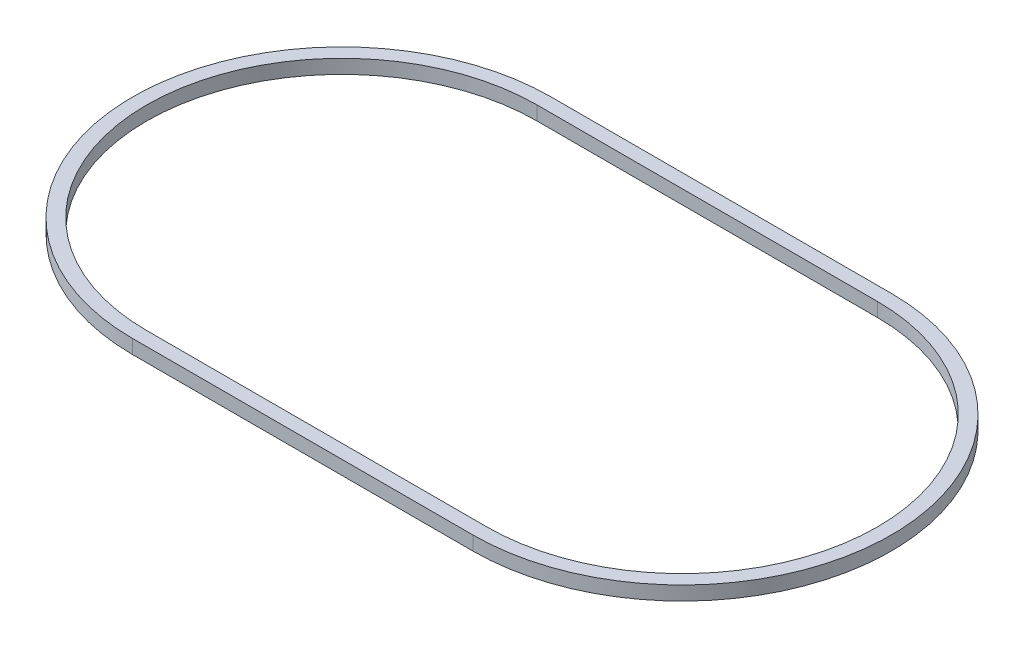
ISO-10303-21;
HEADER;
FILE_DESCRIPTION(('STEP AP214'),'2;1');
FILE_NAME('part.step','',(''),(''),'','','');
FILE_SCHEMA(('AUTOMOTIVE_DESIGN { 1 0 10303 214 1 1 1 1 }'));
ENDSEC;
DATA;
#1=APPLICATION_CONTEXT('core data for automotive mechanical design processes');
#2=APPLICATION_PROTOCOL_DEFINITION('international standard','automotive_design',2000,#1);
#3=PRODUCT_CONTEXT('',#1,'mechanical');
#4=PRODUCT('Part','Part','',(#3));
#5=PRODUCT_RELATED_PRODUCT_CATEGORY('part','',(#4));
#6=PRODUCT_DEFINITION_FORMATION('','',#4);
#7=PRODUCT_DEFINITION_CONTEXT('part definition',#1,'design');
#8=PRODUCT_DEFINITION('design','',#6,#7);
#9=PRODUCT_DEFINITION_SHAPE('','',#8);
#10=(LENGTH_UNIT() NAMED_UNIT(*) SI_UNIT(.MILLI.,.METRE.));
#11=(NAMED_UNIT(*) PLANE_ANGLE_UNIT() SI_UNIT($,.RADIAN.));
#12=(NAMED_UNIT(*) SI_UNIT($,.STERADIAN.) SOLID_ANGLE_UNIT());
#13=UNCERTAINTY_MEASURE_WITH_UNIT(LENGTH_MEASURE(1.E-05),#10,'distance_accuracy_value','');
#14=(GEOMETRIC_REPRESENTATION_CONTEXT(3) GLOBAL_UNCERTAINTY_ASSIGNED_CONTEXT((#13)) GLOBAL_UNIT_ASSIGNED_CONTEXT((#10,
#11,#12)) REPRESENTATION_CONTEXT('',''));
#15=CARTESIAN_POINT('',(0.,0.,0.));
#16=DIRECTION('',(0.,0.,1.));
#17=DIRECTION('',(1.,0.,0.));
#18=AXIS2_PLACEMENT_3D('',#15,#16,#17);
#19=CARTESIAN_POINT('',(0.,2.5,0.));
#20=DIRECTION('',(0.,1.,0.));
#21=DIRECTION('',(0.,0.,1.));
#22=AXIS2_PLACEMENT_3D('',#19,#20,#21);
#23=PLANE('',#22);
#24=CARTESIAN_POINT('',(0.,2.5,0.));
#25=DIRECTION('',(0.,1.,0.));
#26=DIRECTION('',(0.,0.,1.));
#27=AXIS2_PLACEMENT_3D('',#24,#25,#26);
#28=CIRCLE('',#27,37.5);
#29=CARTESIAN_POINT('',(0.,2.5,-37.5));
#30=VERTEX_POINT('',#29);
#31=CARTESIAN_POINT('',(0.,2.5,37.5));
#32=VERTEX_POINT('',#31);
#33=EDGE_CURVE('E133',#30,#32,#28,.T.);
#34=ORIENTED_EDGE('',*,*,#33,.T.);
#35=DIRECTION('',(1.,0.,0.));
#36=VECTOR('',#35,1.);
#37=CARTESIAN_POINT('',(0.,2.5,37.5));
#38=LINE('',#37,#36);
#39=CARTESIAN_POINT('',(61.,2.5,37.5));
#40=VERTEX_POINT('',#39);
#41=EDGE_CURVE('E136',#32,#40,#38,.T.);
#42=ORIENTED_EDGE('',*,*,#41,.T.);
#43=CARTESIAN_POINT('',(61.,2.5,0.));
#44=DIRECTION('',(0.,1.,0.));
#45=DIRECTION('',(0.,0.,1.));
#46=AXIS2_PLACEMENT_3D('',#43,#44,#45);
#47=CIRCLE('',#46,37.5);
#48=CARTESIAN_POINT('',(61.,2.5,-37.5));
#49=VERTEX_POINT('',#48);
#50=EDGE_CURVE('E139',#40,#49,#47,.T.);
#51=ORIENTED_EDGE('',*,*,#50,.T.);
#52=DIRECTION('',(-1.,0.,0.));
#53=VECTOR('',#52,1.);
#54=CARTESIAN_POINT('',(0.,2.5,-37.5));
#55=LINE('',#54,#53);
#56=EDGE_CURVE('E141',#49,#30,#55,.T.);
#57=ORIENTED_EDGE('',*,*,#56,.T.);
#58=EDGE_LOOP('',(#34,#42,#51,#57));
#59=FACE_BOUND('',#58,.T.);
#60=DIRECTION('',(1.,0.,0.));
#61=VECTOR('',#60,1.);
#62=CARTESIAN_POINT('',(0.,2.5,35.));
#63=LINE('',#62,#61);
#64=CARTESIAN_POINT('',(0.,2.5,35.));
#65=VERTEX_POINT('',#64);
#66=CARTESIAN_POINT('',(61.,2.5,35.));
#67=VERTEX_POINT('',#66);
#68=EDGE_CURVE('E105',#65,#67,#63,.T.);
#69=ORIENTED_EDGE('',*,*,#68,.F.);
#70=CARTESIAN_POINT('',(0.,2.5,0.));
#71=DIRECTION('',(0.,1.,0.));
#72=DIRECTION('',(0.,0.,1.));
#73=AXIS2_PLACEMENT_3D('',#70,#71,#72);
#74=CIRCLE('',#73,35.);
#75=CARTESIAN_POINT('',(0.,2.5,-35.));
#76=VERTEX_POINT('',#75);
#77=EDGE_CURVE('E97',#76,#65,#74,.T.);
#78=ORIENTED_EDGE('',*,*,#77,.F.);
#79=DIRECTION('',(-1.,0.,0.));
#80=VECTOR('',#79,1.);
#81=CARTESIAN_POINT('',(0.,2.5,-35.));
#82=LINE('',#81,#80);
#83=CARTESIAN_POINT('',(61.,2.5,-35.));
#84=VERTEX_POINT('',#83);
#85=EDGE_CURVE('E119',#84,#76,#82,.T.);
#86=ORIENTED_EDGE('',*,*,#85,.F.);
#87=CARTESIAN_POINT('',(61.,2.5,0.));
#88=DIRECTION('',(0.,1.,0.));
#89=DIRECTION('',(0.,0.,1.));
#90=AXIS2_PLACEMENT_3D('',#87,#88,#89);
#91=CIRCLE('',#90,35.);
#92=EDGE_CURVE('E117',#67,#84,#91,.T.);
#93=ORIENTED_EDGE('',*,*,#92,.F.);
#94=EDGE_LOOP('',(#69,#78,#86,#93));
#95=FACE_BOUND('',#94,.T.);
#96=ADVANCED_FACE('F32',(#59,#95),#23,.T.);
#97=CARTESIAN_POINT('',(0.,0.,0.));
#98=DIRECTION('',(0.,1.,0.));
#99=DIRECTION('',(0.,0.,1.));
#100=AXIS2_PLACEMENT_3D('',#97,#98,#99);
#101=PLANE('',#100);
#102=CARTESIAN_POINT('',(0.,0.,0.));
#103=DIRECTION('',(0.,1.,0.));
#104=DIRECTION('',(0.,0.,1.));
#105=AXIS2_PLACEMENT_3D('',#102,#103,#104);
#106=CIRCLE('',#105,37.5);
#107=CARTESIAN_POINT('',(0.,0.,-37.5));
#108=VERTEX_POINT('',#107);
#109=CARTESIAN_POINT('',(0.,0.,37.5));
#110=VERTEX_POINT('',#109);
#111=EDGE_CURVE('E113',#108,#110,#106,.T.);
#112=ORIENTED_EDGE('',*,*,#111,.F.);
#113=DIRECTION('',(-1.,0.,0.));
#114=VECTOR('',#113,1.);
#115=CARTESIAN_POINT('',(0.,0.,-37.5));
#116=LINE('',#115,#114);
#117=CARTESIAN_POINT('',(61.,0.,-37.5));
#118=VERTEX_POINT('',#117);
#119=EDGE_CURVE('E137',#118,#108,#116,.T.);
#120=ORIENTED_EDGE('',*,*,#119,.F.);
#121=CARTESIAN_POINT('',(61.,0.,0.));
#122=DIRECTION('',(0.,1.,0.));
#123=DIRECTION('',(0.,0.,1.));
#124=AXIS2_PLACEMENT_3D('',#121,#122,#123);
#125=CIRCLE('',#124,37.5);
#126=CARTESIAN_POINT('',(61.,0.,37.5));
#127=VERTEX_POINT('',#126);
#128=EDGE_CURVE('E148',#127,#118,#125,.T.);
#129=ORIENTED_EDGE('',*,*,#128,.F.);
#130=DIRECTION('',(1.,0.,0.));
#131=VECTOR('',#130,1.);
#132=CARTESIAN_POINT('',(0.,0.,37.5));
#133=LINE('',#132,#131);
#134=EDGE_CURVE('E146',#110,#127,#133,.T.);
#135=ORIENTED_EDGE('',*,*,#134,.F.);
#136=EDGE_LOOP('',(#112,#120,#129,#135));
#137=FACE_BOUND('',#136,.T.);
#138=CARTESIAN_POINT('',(0.,0.,0.));
#139=DIRECTION('',(0.,1.,0.));
#140=DIRECTION('',(0.,0.,1.));
#141=AXIS2_PLACEMENT_3D('',#138,#139,#140);
#142=CIRCLE('',#141,35.);
#143=CARTESIAN_POINT('',(0.,0.,-35.));
#144=VERTEX_POINT('',#143);
#145=CARTESIAN_POINT('',(0.,0.,35.));
#146=VERTEX_POINT('',#145);
#147=EDGE_CURVE('E55',#144,#146,#142,.T.);
#148=ORIENTED_EDGE('',*,*,#147,.T.);
#149=DIRECTION('',(1.,0.,0.));
#150=VECTOR('',#149,1.);
#151=CARTESIAN_POINT('',(0.,0.,35.));
#152=LINE('',#151,#150);
#153=CARTESIAN_POINT('',(61.,0.,35.));
#154=VERTEX_POINT('',#153);
#155=EDGE_CURVE('E112',#146,#154,#152,.T.);
#156=ORIENTED_EDGE('',*,*,#155,.T.);
#157=CARTESIAN_POINT('',(61.,0.,0.));
#158=DIRECTION('',(0.,1.,0.));
#159=DIRECTION('',(0.,0.,1.));
#160=AXIS2_PLACEMENT_3D('',#157,#158,#159);
#161=CIRCLE('',#160,35.);
#162=CARTESIAN_POINT('',(61.,0.,-35.));
#163=VERTEX_POINT('',#162);
#164=EDGE_CURVE('E125',#154,#163,#161,.T.);
#165=ORIENTED_EDGE('',*,*,#164,.T.);
#166=DIRECTION('',(-1.,0.,0.));
#167=VECTOR('',#166,1.);
#168=CARTESIAN_POINT('',(0.,0.,-35.));
#169=LINE('',#168,#167);
#170=EDGE_CURVE('E106',#163,#144,#169,.T.);
#171=ORIENTED_EDGE('',*,*,#170,.T.);
#172=EDGE_LOOP('',(#148,#156,#165,#171));
#173=FACE_BOUND('',#172,.T.);
#174=ADVANCED_FACE('F166',(#137,#173),#101,.F.);
#175=CARTESIAN_POINT('',(0.,2.5,0.));
#176=DIRECTION('',(0.,-1.,0.));
#177=DIRECTION('',(0.,0.,-1.));
#178=AXIS2_PLACEMENT_3D('',#175,#176,#177);
#179=CYLINDRICAL_SURFACE('',#178,37.5);
#180=ORIENTED_EDGE('',*,*,#111,.T.);
#181=DIRECTION('',(0.,-1.,0.));
#182=VECTOR('',#181,1.);
#183=CARTESIAN_POINT('',(0.,2.5,37.5));
#184=LINE('',#183,#182);
#185=EDGE_CURVE('E11',#32,#110,#184,.T.);
#186=ORIENTED_EDGE('',*,*,#185,.F.);
#187=ORIENTED_EDGE('',*,*,#33,.F.);
#188=DIRECTION('',(0.,-1.,0.));
#189=VECTOR('',#188,1.);
#190=CARTESIAN_POINT('',(0.,2.5,-37.5));
#191=LINE('',#190,#189);
#192=EDGE_CURVE('E143',#30,#108,#191,.T.);
#193=ORIENTED_EDGE('',*,*,#192,.T.);
#194=EDGE_LOOP('',(#180,#186,#187,#193));
#195=FACE_BOUND('',#194,.T.);
#196=ADVANCED_FACE('F34',(#195),#179,.T.);
#197=CARTESIAN_POINT('',(0.,2.5,37.5));
#198=DIRECTION('',(0.,0.,-1.));
#199=DIRECTION('',(-1.,0.,0.));
#200=AXIS2_PLACEMENT_3D('',#197,#198,#199);
#201=PLANE('',#200);
#202=ORIENTED_EDGE('',*,*,#134,.T.);
#203=DIRECTION('',(0.,-1.,0.));
#204=VECTOR('',#203,1.);
#205=CARTESIAN_POINT('',(61.,2.5,37.5));
#206=LINE('',#205,#204);
#207=EDGE_CURVE('E40',#40,#127,#206,.T.);
#208=ORIENTED_EDGE('',*,*,#207,.F.);
#209=ORIENTED_EDGE('',*,*,#41,.F.);
#210=ORIENTED_EDGE('',*,*,#185,.T.);
#211=EDGE_LOOP('',(#202,#208,#209,#210));
#212=FACE_BOUND('',#211,.T.);
#213=ADVANCED_FACE('F176',(#212),#201,.F.);
#214=CARTESIAN_POINT('',(61.,2.5,0.));
#215=DIRECTION('',(0.,-1.,0.));
#216=DIRECTION('',(0.,0.,-1.));
#217=AXIS2_PLACEMENT_3D('',#214,#215,#216);
#218=CYLINDRICAL_SURFACE('',#217,37.5);
#219=ORIENTED_EDGE('',*,*,#128,.T.);
#220=DIRECTION('',(0.,-1.,0.));
#221=VECTOR('',#220,1.);
#222=CARTESIAN_POINT('',(61.,2.5,-37.5));
#223=LINE('',#222,#221);
#224=EDGE_CURVE('E153',#49,#118,#223,.T.);
#225=ORIENTED_EDGE('',*,*,#224,.F.);
#226=ORIENTED_EDGE('',*,*,#50,.F.);
#227=ORIENTED_EDGE('',*,*,#207,.T.);
#228=EDGE_LOOP('',(#219,#225,#226,#227));
#229=FACE_BOUND('',#228,.T.);
#230=ADVANCED_FACE('F160',(#229),#218,.T.);
#231=CARTESIAN_POINT('',(0.,2.5,-37.5));
#232=DIRECTION('',(0.,0.,1.));
#233=DIRECTION('',(1.,0.,0.));
#234=AXIS2_PLACEMENT_3D('',#231,#232,#233);
#235=PLANE('',#234);
#236=ORIENTED_EDGE('',*,*,#119,.T.);
#237=ORIENTED_EDGE('',*,*,#192,.F.);
#238=ORIENTED_EDGE('',*,*,#56,.F.);
#239=ORIENTED_EDGE('',*,*,#224,.T.);
#240=EDGE_LOOP('',(#236,#237,#238,#239));
#241=FACE_BOUND('',#240,.T.);
#242=ADVANCED_FACE('F170',(#241),#235,.F.);
#243=CARTESIAN_POINT('',(0.,2.5,0.));
#244=DIRECTION('',(0.,-1.,0.));
#245=DIRECTION('',(0.,0.,-1.));
#246=AXIS2_PLACEMENT_3D('',#243,#244,#245);
#247=CYLINDRICAL_SURFACE('',#246,35.);
#248=ORIENTED_EDGE('',*,*,#147,.F.);
#249=DIRECTION('',(0.,-1.,0.));
#250=VECTOR('',#249,1.);
#251=CARTESIAN_POINT('',(0.,2.5,-35.));
#252=LINE('',#251,#250);
#253=EDGE_CURVE('E101',#76,#144,#252,.T.);
#254=ORIENTED_EDGE('',*,*,#253,.F.);
#255=ORIENTED_EDGE('',*,*,#77,.T.);
#256=DIRECTION('',(0.,-1.,0.));
#257=VECTOR('',#256,1.);
#258=CARTESIAN_POINT('',(0.,2.5,35.));
#259=LINE('',#258,#257);
#260=EDGE_CURVE('E100',#65,#146,#259,.T.);
#261=ORIENTED_EDGE('',*,*,#260,.T.);
#262=EDGE_LOOP('',(#248,#254,#255,#261));
#263=FACE_BOUND('',#262,.T.);
#264=ADVANCED_FACE('F99',(#263),#247,.F.);
#265=CARTESIAN_POINT('',(0.,2.5,35.));
#266=DIRECTION('',(0.,0.,-1.));
#267=DIRECTION('',(-1.,0.,0.));
#268=AXIS2_PLACEMENT_3D('',#265,#266,#267);
#269=PLANE('',#268);
#270=ORIENTED_EDGE('',*,*,#155,.F.);
#271=ORIENTED_EDGE('',*,*,#260,.F.);
#272=ORIENTED_EDGE('',*,*,#68,.T.);
#273=DIRECTION('',(0.,-1.,0.));
#274=VECTOR('',#273,1.);
#275=CARTESIAN_POINT('',(61.,2.5,35.));
#276=LINE('',#275,#274);
#277=EDGE_CURVE('E114',#67,#154,#276,.T.);
#278=ORIENTED_EDGE('',*,*,#277,.T.);
#279=EDGE_LOOP('',(#270,#271,#272,#278));
#280=FACE_BOUND('',#279,.T.);
#281=ADVANCED_FACE('F109',(#280),#269,.T.);
#282=CARTESIAN_POINT('',(61.,2.5,0.));
#283=DIRECTION('',(0.,-1.,0.));
#284=DIRECTION('',(0.,0.,-1.));
#285=AXIS2_PLACEMENT_3D('',#282,#283,#284);
#286=CYLINDRICAL_SURFACE('',#285,35.);
#287=ORIENTED_EDGE('',*,*,#164,.F.);
#288=ORIENTED_EDGE('',*,*,#277,.F.);
#289=ORIENTED_EDGE('',*,*,#92,.T.);
#290=DIRECTION('',(0.,-1.,0.));
#291=VECTOR('',#290,1.);
#292=CARTESIAN_POINT('',(61.,2.5,-35.));
#293=LINE('',#292,#291);
#294=EDGE_CURVE('E47',#84,#163,#293,.T.);
#295=ORIENTED_EDGE('',*,*,#294,.T.);
#296=EDGE_LOOP('',(#287,#288,#289,#295));
#297=FACE_BOUND('',#296,.T.);
#298=ADVANCED_FACE('F199',(#297),#286,.F.);
#299=CARTESIAN_POINT('',(0.,2.5,-35.));
#300=DIRECTION('',(0.,0.,1.));
#301=DIRECTION('',(1.,0.,0.));
#302=AXIS2_PLACEMENT_3D('',#299,#300,#301);
#303=PLANE('',#302);
#304=ORIENTED_EDGE('',*,*,#170,.F.);
#305=ORIENTED_EDGE('',*,*,#294,.F.);
#306=ORIENTED_EDGE('',*,*,#85,.T.);
#307=ORIENTED_EDGE('',*,*,#253,.T.);
#308=EDGE_LOOP('',(#304,#305,#306,#307));
#309=FACE_BOUND('',#308,.T.);
#310=ADVANCED_FACE('F203',(#309),#303,.T.);
#311=CLOSED_SHELL('',(#96,#174,#196,#213,#230,#242,#264,#281,#298,#310));
#312=MANIFOLD_SOLID_BREP('B2',#311);
#313=ADVANCED_BREP_SHAPE_REPRESENTATION('',(#18,#312),#14);
#314=SHAPE_DEFINITION_REPRESENTATION(#9,#313);
ENDSEC;
END-ISO-10303-21;
